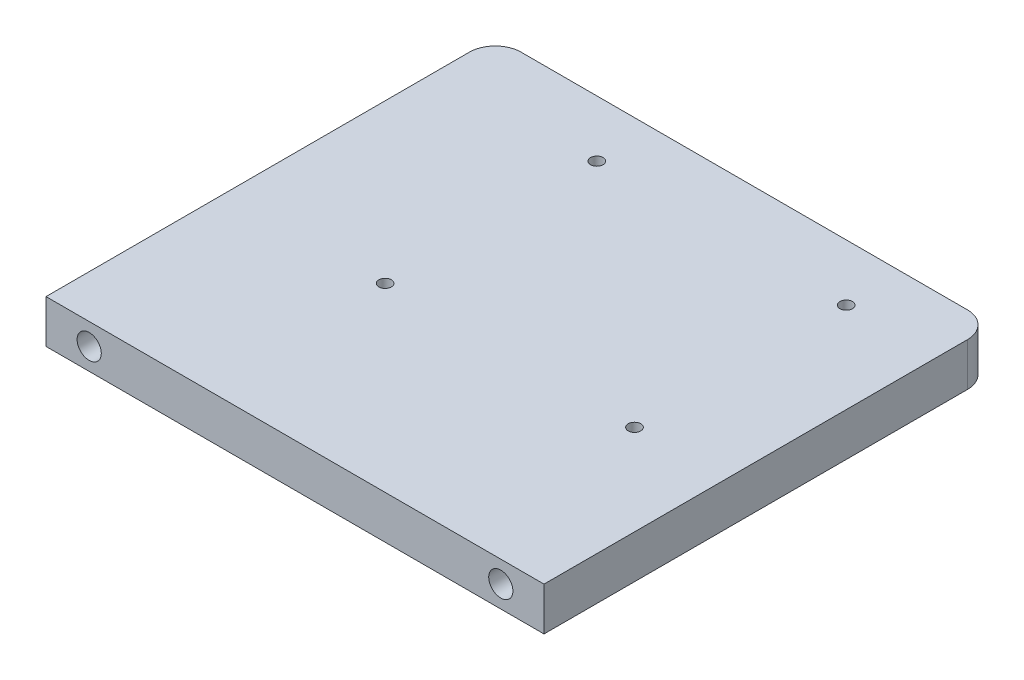
ISO-10303-21;
HEADER;
FILE_DESCRIPTION(('STEP AP214'),'2;1');
FILE_NAME('part.step','',(''),(''),'','','');
FILE_SCHEMA(('AUTOMOTIVE_DESIGN { 1 0 10303 214 1 1 1 1 }'));
ENDSEC;
DATA;
#1=APPLICATION_CONTEXT('core data for automotive mechanical design processes');
#2=APPLICATION_PROTOCOL_DEFINITION('international standard','automotive_design',2000,#1);
#3=PRODUCT_CONTEXT('',#1,'mechanical');
#4=PRODUCT('Part','Part','',(#3));
#5=PRODUCT_RELATED_PRODUCT_CATEGORY('part','',(#4));
#6=PRODUCT_DEFINITION_FORMATION('','',#4);
#7=PRODUCT_DEFINITION_CONTEXT('part definition',#1,'design');
#8=PRODUCT_DEFINITION('design','',#6,#7);
#9=PRODUCT_DEFINITION_SHAPE('','',#8);
#10=(LENGTH_UNIT() NAMED_UNIT(*) SI_UNIT(.MILLI.,.METRE.));
#11=(NAMED_UNIT(*) PLANE_ANGLE_UNIT() SI_UNIT($,.RADIAN.));
#12=(NAMED_UNIT(*) SI_UNIT($,.STERADIAN.) SOLID_ANGLE_UNIT());
#13=UNCERTAINTY_MEASURE_WITH_UNIT(LENGTH_MEASURE(1.E-05),#10,'distance_accuracy_value','');
#14=(GEOMETRIC_REPRESENTATION_CONTEXT(3) GLOBAL_UNCERTAINTY_ASSIGNED_CONTEXT((#13)) GLOBAL_UNIT_ASSIGNED_CONTEXT((#10,
#11,#12)) REPRESENTATION_CONTEXT('',''));
#15=CARTESIAN_POINT('',(0.,0.,0.));
#16=DIRECTION('',(0.,0.,1.));
#17=DIRECTION('',(1.,0.,0.));
#18=AXIS2_PLACEMENT_3D('',#15,#16,#17);
#19=CARTESIAN_POINT('',(62.5,55.,-79.8892794376098));
#20=DIRECTION('',(-1.,0.,0.));
#21=DIRECTION('',(0.,0.,1.));
#22=AXIS2_PLACEMENT_3D('',#19,#20,#21);
#23=PLANE('',#22);
#24=DIRECTION('',(0.,0.,1.));
#25=VECTOR('',#24,1.);
#26=CARTESIAN_POINT('',(62.5,55.,-79.8892794376098));
#27=LINE('',#26,#25);
#28=CARTESIAN_POINT('',(62.5,55.,-73.8892794376098));
#29=VERTEX_POINT('',#28);
#30=CARTESIAN_POINT('',(62.5,55.,24.1107205623902));
#31=VERTEX_POINT('',#30);
#32=EDGE_CURVE('E182',#29,#31,#27,.T.);
#33=ORIENTED_EDGE('',*,*,#32,.F.);
#34=DIRECTION('',(0.,-1.,0.));
#35=VECTOR('',#34,1.);
#36=CARTESIAN_POINT('',(62.5,55.,-73.8892794376098));
#37=LINE('',#36,#35);
#38=CARTESIAN_POINT('',(62.5,65.,-73.8892794376098));
#39=VERTEX_POINT('',#38);
#40=EDGE_CURVE('E64',#29,#39,#37,.F.);
#41=ORIENTED_EDGE('',*,*,#40,.T.);
#42=DIRECTION('',(0.,0.,1.));
#43=VECTOR('',#42,1.);
#44=CARTESIAN_POINT('',(62.5,65.,-79.8892794376098));
#45=LINE('',#44,#43);
#46=CARTESIAN_POINT('',(62.5,65.,24.1107205623901));
#47=VERTEX_POINT('',#46);
#48=EDGE_CURVE('E165',#39,#47,#45,.T.);
#49=ORIENTED_EDGE('',*,*,#48,.T.);
#50=DIRECTION('',(0.,-1.,0.));
#51=VECTOR('',#50,1.);
#52=CARTESIAN_POINT('',(62.5,55.,24.1107205623901));
#53=LINE('',#52,#51);
#54=EDGE_CURVE('E157',#47,#31,#53,.T.);
#55=ORIENTED_EDGE('',*,*,#54,.T.);
#56=EDGE_LOOP('',(#33,#41,#49,#55));
#57=FACE_BOUND('',#56,.T.);
#58=ADVANCED_FACE('F41',(#57),#23,.F.);
#59=CARTESIAN_POINT('',(62.5,55.,-79.8892794376098));
#60=DIRECTION('',(0.,1.,0.));
#61=DIRECTION('',(0.,0.,1.));
#62=AXIS2_PLACEMENT_3D('',#59,#60,#61);
#63=PLANE('',#62);
#64=CARTESIAN_POINT('',(-16.187618629174,55.,-66.7992794376098));
#65=DIRECTION('',(0.,-1.,0.));
#66=DIRECTION('',(0.,0.,-1.));
#67=AXIS2_PLACEMENT_3D('',#64,#65,#66);
#68=CIRCLE('',#67,2.75);
#69=CARTESIAN_POINT('',(-16.187618629174,55.,-69.5492794376098));
#70=VERTEX_POINT('',#69);
#71=EDGE_CURVE('E121',#70,#70,#68,.T.);
#72=ORIENTED_EDGE('',*,*,#71,.F.);
#73=EDGE_LOOP('',(#72));
#74=FACE_BOUND('',#73,.T.);
#75=CARTESIAN_POINT('',(41.542381370826,55.,-66.7992794376098));
#76=DIRECTION('',(0.,-1.,0.));
#77=DIRECTION('',(0.,0.,-1.));
#78=AXIS2_PLACEMENT_3D('',#75,#76,#77);
#79=CIRCLE('',#78,2.75);
#80=CARTESIAN_POINT('',(41.542381370826,55.,-69.5492794376098));
#81=VERTEX_POINT('',#80);
#82=EDGE_CURVE('E130',#81,#81,#79,.T.);
#83=ORIENTED_EDGE('',*,*,#82,.F.);
#84=EDGE_LOOP('',(#83));
#85=FACE_BOUND('',#84,.T.);
#86=CARTESIAN_POINT('',(-16.187618629174,55.,-17.7892794376098));
#87=DIRECTION('',(0.,-1.,0.));
#88=DIRECTION('',(0.,0.,-1.));
#89=AXIS2_PLACEMENT_3D('',#86,#87,#88);
#90=CIRCLE('',#89,2.75);
#91=CARTESIAN_POINT('',(-16.187618629174,55.,-20.5392794376098));
#92=VERTEX_POINT('',#91);
#93=EDGE_CURVE('E139',#92,#92,#90,.T.);
#94=ORIENTED_EDGE('',*,*,#93,.F.);
#95=EDGE_LOOP('',(#94));
#96=FACE_BOUND('',#95,.T.);
#97=CARTESIAN_POINT('',(41.542381370826,55.,-17.7892794376098));
#98=DIRECTION('',(0.,-1.,0.));
#99=DIRECTION('',(0.,0.,-1.));
#100=AXIS2_PLACEMENT_3D('',#97,#98,#99);
#101=CIRCLE('',#100,2.75);
#102=CARTESIAN_POINT('',(41.542381370826,55.,-20.5392794376098));
#103=VERTEX_POINT('',#102);
#104=EDGE_CURVE('E148',#103,#103,#101,.T.);
#105=ORIENTED_EDGE('',*,*,#104,.F.);
#106=EDGE_LOOP('',(#105));
#107=FACE_BOUND('',#106,.T.);
#108=DIRECTION('',(-1.,0.,0.));
#109=VECTOR('',#108,1.);
#110=CARTESIAN_POINT('',(62.5,55.,-79.8892794376098));
#111=LINE('',#110,#109);
#112=CARTESIAN_POINT('',(56.5,55.,-79.8892794376098));
#113=VERTEX_POINT('',#112);
#114=CARTESIAN_POINT('',(-46.792618629174,55.,-79.8892794376098));
#115=VERTEX_POINT('',#114);
#116=EDGE_CURVE('E158',#113,#115,#111,.T.);
#117=ORIENTED_EDGE('',*,*,#116,.F.);
#118=CARTESIAN_POINT('',(56.5,55.,-73.8892794376098));
#119=DIRECTION('',(0.,1.,0.));
#120=DIRECTION('',(0.,0.,1.));
#121=AXIS2_PLACEMENT_3D('',#118,#119,#120);
#122=CIRCLE('',#121,6.);
#123=EDGE_CURVE('E193',#113,#29,#122,.F.);
#124=ORIENTED_EDGE('',*,*,#123,.T.);
#125=ORIENTED_EDGE('',*,*,#32,.T.);
#126=DIRECTION('',(-1.,0.,0.));
#127=VECTOR('',#126,1.);
#128=CARTESIAN_POINT('',(62.5,55.,24.1107205623901));
#129=LINE('',#128,#127);
#130=CARTESIAN_POINT('',(-52.792618629174,55.,24.1107205623902));
#131=VERTEX_POINT('',#130);
#132=EDGE_CURVE('E168',#31,#131,#129,.T.);
#133=ORIENTED_EDGE('',*,*,#132,.T.);
#134=DIRECTION('',(0.,0.,1.));
#135=VECTOR('',#134,1.);
#136=CARTESIAN_POINT('',(-52.792618629174,55.,-79.8892794376098));
#137=LINE('',#136,#135);
#138=CARTESIAN_POINT('',(-52.792618629174,55.,-73.8892794376098));
#139=VERTEX_POINT('',#138);
#140=EDGE_CURVE('E179',#139,#131,#137,.T.);
#141=ORIENTED_EDGE('',*,*,#140,.F.);
#142=CARTESIAN_POINT('',(-46.792618629174,55.,-73.8892794376098));
#143=DIRECTION('',(0.,1.,0.));
#144=DIRECTION('',(0.,0.,1.));
#145=AXIS2_PLACEMENT_3D('',#142,#143,#144);
#146=CIRCLE('',#145,6.);
#147=EDGE_CURVE('E191',#139,#115,#146,.F.);
#148=ORIENTED_EDGE('',*,*,#147,.T.);
#149=EDGE_LOOP('',(#117,#124,#125,#133,#141,#148));
#150=FACE_BOUND('',#149,.T.);
#151=ADVANCED_FACE('F206',(#74,#85,#96,#107,#150),#63,.F.);
#152=CARTESIAN_POINT('',(-52.792618629174,55.,-79.8892794376098));
#153=DIRECTION('',(1.,0.,0.));
#154=DIRECTION('',(0.,1.,0.));
#155=AXIS2_PLACEMENT_3D('',#152,#153,#154);
#156=PLANE('',#155);
#157=DIRECTION('',(0.,0.,1.));
#158=VECTOR('',#157,1.);
#159=CARTESIAN_POINT('',(-52.792618629174,65.,-79.8892794376098));
#160=LINE('',#159,#158);
#161=CARTESIAN_POINT('',(-52.792618629174,65.,-73.8892794376098));
#162=VERTEX_POINT('',#161);
#163=CARTESIAN_POINT('',(-52.792618629174,65.,24.1107205623902));
#164=VERTEX_POINT('',#163);
#165=EDGE_CURVE('E177',#162,#164,#160,.T.);
#166=ORIENTED_EDGE('',*,*,#165,.F.);
#167=DIRECTION('',(0.,1.,0.));
#168=VECTOR('',#167,1.);
#169=CARTESIAN_POINT('',(-52.792618629174,55.,-73.8892794376098));
#170=LINE('',#169,#168);
#171=EDGE_CURVE('E11',#162,#139,#170,.F.);
#172=ORIENTED_EDGE('',*,*,#171,.T.);
#173=ORIENTED_EDGE('',*,*,#140,.T.);
#174=DIRECTION('',(0.,1.,0.));
#175=VECTOR('',#174,1.);
#176=CARTESIAN_POINT('',(-52.792618629174,55.,24.1107205623902));
#177=LINE('',#176,#175);
#178=EDGE_CURVE('E171',#131,#164,#177,.T.);
#179=ORIENTED_EDGE('',*,*,#178,.T.);
#180=EDGE_LOOP('',(#166,#172,#173,#179));
#181=FACE_BOUND('',#180,.T.);
#182=ADVANCED_FACE('F214',(#181),#156,.F.);
#183=CARTESIAN_POINT('',(62.5,65.,-79.8892794376098));
#184=DIRECTION('',(0.,-1.,0.));
#185=DIRECTION('',(0.,0.,-1.));
#186=AXIS2_PLACEMENT_3D('',#183,#184,#185);
#187=PLANE('',#186);
#188=CARTESIAN_POINT('',(-16.187618629174,65.,-66.7992794376098));
#189=DIRECTION('',(0.,-1.,0.));
#190=DIRECTION('',(0.,0.,-1.));
#191=AXIS2_PLACEMENT_3D('',#188,#189,#190);
#192=CIRCLE('',#191,1.44999999999999);
#193=CARTESIAN_POINT('',(-16.187618629174,65.,-68.2492794376098));
#194=VERTEX_POINT('',#193);
#195=EDGE_CURVE('E127',#194,#194,#192,.T.);
#196=ORIENTED_EDGE('',*,*,#195,.T.);
#197=EDGE_LOOP('',(#196));
#198=FACE_BOUND('',#197,.T.);
#199=CARTESIAN_POINT('',(41.542381370826,65.,-66.7992794376098));
#200=DIRECTION('',(0.,-1.,0.));
#201=DIRECTION('',(0.,0.,-1.));
#202=AXIS2_PLACEMENT_3D('',#199,#200,#201);
#203=CIRCLE('',#202,1.44999999999999);
#204=CARTESIAN_POINT('',(41.542381370826,65.,-68.2492794376098));
#205=VERTEX_POINT('',#204);
#206=EDGE_CURVE('E136',#205,#205,#203,.T.);
#207=ORIENTED_EDGE('',*,*,#206,.T.);
#208=EDGE_LOOP('',(#207));
#209=FACE_BOUND('',#208,.T.);
#210=CARTESIAN_POINT('',(-16.187618629174,65.,-17.7892794376098));
#211=DIRECTION('',(0.,-1.,0.));
#212=DIRECTION('',(0.,0.,-1.));
#213=AXIS2_PLACEMENT_3D('',#210,#211,#212);
#214=CIRCLE('',#213,1.44999999999999);
#215=CARTESIAN_POINT('',(-16.187618629174,65.,-19.2392794376098));
#216=VERTEX_POINT('',#215);
#217=EDGE_CURVE('E145',#216,#216,#214,.T.);
#218=ORIENTED_EDGE('',*,*,#217,.T.);
#219=EDGE_LOOP('',(#218));
#220=FACE_BOUND('',#219,.T.);
#221=CARTESIAN_POINT('',(41.542381370826,65.,-17.7892794376098));
#222=DIRECTION('',(0.,-1.,0.));
#223=DIRECTION('',(0.,0.,-1.));
#224=AXIS2_PLACEMENT_3D('',#221,#222,#223);
#225=CIRCLE('',#224,1.44999999999999);
#226=CARTESIAN_POINT('',(41.542381370826,65.,-19.2392794376098));
#227=VERTEX_POINT('',#226);
#228=EDGE_CURVE('E154',#227,#227,#225,.T.);
#229=ORIENTED_EDGE('',*,*,#228,.T.);
#230=EDGE_LOOP('',(#229));
#231=FACE_BOUND('',#230,.T.);
#232=ORIENTED_EDGE('',*,*,#48,.F.);
#233=CARTESIAN_POINT('',(56.5,65.,-73.8892794376098));
#234=DIRECTION('',(0.,-1.,0.));
#235=DIRECTION('',(0.,0.,-1.));
#236=AXIS2_PLACEMENT_3D('',#233,#234,#235);
#237=CIRCLE('',#236,6.);
#238=CARTESIAN_POINT('',(56.5,65.,-79.8892794376098));
#239=VERTEX_POINT('',#238);
#240=EDGE_CURVE('E49',#39,#239,#237,.F.);
#241=ORIENTED_EDGE('',*,*,#240,.T.);
#242=DIRECTION('',(1.,0.,0.));
#243=VECTOR('',#242,1.);
#244=CARTESIAN_POINT('',(62.5,65.,-79.8892794376098));
#245=LINE('',#244,#243);
#246=CARTESIAN_POINT('',(-46.792618629174,65.,-79.8892794376098));
#247=VERTEX_POINT('',#246);
#248=EDGE_CURVE('E161',#247,#239,#245,.T.);
#249=ORIENTED_EDGE('',*,*,#248,.F.);
#250=CARTESIAN_POINT('',(-46.792618629174,65.,-73.8892794376098));
#251=DIRECTION('',(0.,-1.,0.));
#252=DIRECTION('',(0.,0.,-1.));
#253=AXIS2_PLACEMENT_3D('',#250,#251,#252);
#254=CIRCLE('',#253,6.);
#255=EDGE_CURVE('E56',#247,#162,#254,.F.);
#256=ORIENTED_EDGE('',*,*,#255,.T.);
#257=ORIENTED_EDGE('',*,*,#165,.T.);
#258=DIRECTION('',(1.,0.,0.));
#259=VECTOR('',#258,1.);
#260=CARTESIAN_POINT('',(62.5,65.,24.1107205623901));
#261=LINE('',#260,#259);
#262=EDGE_CURVE('E162',#164,#47,#261,.T.);
#263=ORIENTED_EDGE('',*,*,#262,.T.);
#264=EDGE_LOOP('',(#232,#241,#249,#256,#257,#263));
#265=FACE_BOUND('',#264,.T.);
#266=ADVANCED_FACE('F197',(#198,#209,#220,#231,#265),#187,.F.);
#267=CARTESIAN_POINT('',(0.,0.,-79.8892794376098));
#268=DIRECTION('',(0.,0.,1.));
#269=DIRECTION('',(1.,0.,0.));
#270=AXIS2_PLACEMENT_3D('',#267,#268,#269);
#271=PLANE('',#270);
#272=ORIENTED_EDGE('',*,*,#248,.T.);
#273=DIRECTION('',(0.,-1.,0.));
#274=VECTOR('',#273,1.);
#275=CARTESIAN_POINT('',(56.5,0.,-79.8892794376098));
#276=LINE('',#275,#274);
#277=EDGE_CURVE('E188',#239,#113,#276,.T.);
#278=ORIENTED_EDGE('',*,*,#277,.T.);
#279=ORIENTED_EDGE('',*,*,#116,.T.);
#280=DIRECTION('',(0.,1.,0.));
#281=VECTOR('',#280,1.);
#282=CARTESIAN_POINT('',(-46.7926186291741,0.,-79.8892794376098));
#283=LINE('',#282,#281);
#284=EDGE_CURVE('E185',#115,#247,#283,.T.);
#285=ORIENTED_EDGE('',*,*,#284,.T.);
#286=EDGE_LOOP('',(#272,#278,#279,#285));
#287=FACE_BOUND('',#286,.T.);
#288=ADVANCED_FACE('F201',(#287),#271,.F.);
#289=CARTESIAN_POINT('',(56.5,0.,-73.8892794376098));
#290=DIRECTION('',(0.,-1.,0.));
#291=DIRECTION('',(0.,0.,-1.));
#292=AXIS2_PLACEMENT_3D('',#289,#290,#291);
#293=CYLINDRICAL_SURFACE('',#292,6.);
#294=ORIENTED_EDGE('',*,*,#240,.F.);
#295=ORIENTED_EDGE('',*,*,#40,.F.);
#296=ORIENTED_EDGE('',*,*,#123,.F.);
#297=ORIENTED_EDGE('',*,*,#277,.F.);
#298=EDGE_LOOP('',(#294,#295,#296,#297));
#299=FACE_BOUND('',#298,.T.);
#300=ADVANCED_FACE('F204',(#299),#293,.T.);
#301=CARTESIAN_POINT('',(-46.7926186291741,0.,-73.8892794376098));
#302=DIRECTION('',(0.,1.,0.));
#303=DIRECTION('',(-1.,0.,0.));
#304=AXIS2_PLACEMENT_3D('',#301,#302,#303);
#305=CYLINDRICAL_SURFACE('',#304,6.);
#306=ORIENTED_EDGE('',*,*,#147,.F.);
#307=ORIENTED_EDGE('',*,*,#171,.F.);
#308=ORIENTED_EDGE('',*,*,#255,.F.);
#309=ORIENTED_EDGE('',*,*,#284,.F.);
#310=EDGE_LOOP('',(#306,#307,#308,#309));
#311=FACE_BOUND('',#310,.T.);
#312=ADVANCED_FACE('F43',(#311),#305,.T.);
#313=CARTESIAN_POINT('',(41.542381370826,55.,-17.7892794376098));
#314=DIRECTION('',(0.,-1.,0.));
#315=DIRECTION('',(0.,0.,-1.));
#316=AXIS2_PLACEMENT_3D('',#313,#314,#315);
#317=CYLINDRICAL_SURFACE('',#316,1.44999999999999);
#318=ORIENTED_EDGE('',*,*,#228,.F.);
#319=EDGE_LOOP('',(#318));
#320=FACE_BOUND('',#319,.T.);
#321=CARTESIAN_POINT('',(41.542381370826,56.3,-17.7892794376098));
#322=DIRECTION('',(0.,-1.,0.));
#323=DIRECTION('',(0.,0.,-1.));
#324=AXIS2_PLACEMENT_3D('',#321,#322,#323);
#325=CIRCLE('',#324,1.44999999999999);
#326=CARTESIAN_POINT('',(41.542381370826,56.3,-19.2392794376098));
#327=VERTEX_POINT('',#326);
#328=EDGE_CURVE('E151',#327,#327,#325,.T.);
#329=ORIENTED_EDGE('',*,*,#328,.T.);
#330=EDGE_LOOP('',(#329));
#331=FACE_BOUND('',#330,.T.);
#332=ADVANCED_FACE('F234',(#320,#331),#317,.F.);
#333=CARTESIAN_POINT('',(41.542381370826,55.,-17.7892794376098));
#334=DIRECTION('',(0.,-1.,0.));
#335=DIRECTION('',(0.,0.,-1.));
#336=AXIS2_PLACEMENT_3D('',#333,#334,#335);
#337=CONICAL_SURFACE('',#336,2.75,0.785398163397451);
#338=ORIENTED_EDGE('',*,*,#328,.F.);
#339=EDGE_LOOP('',(#338));
#340=FACE_BOUND('',#339,.T.);
#341=ORIENTED_EDGE('',*,*,#104,.T.);
#342=EDGE_LOOP('',(#341));
#343=FACE_BOUND('',#342,.T.);
#344=ADVANCED_FACE('F241',(#340,#343),#337,.F.);
#345=CARTESIAN_POINT('',(-16.187618629174,55.,-17.7892794376098));
#346=DIRECTION('',(0.,-1.,0.));
#347=DIRECTION('',(0.,0.,-1.));
#348=AXIS2_PLACEMENT_3D('',#345,#346,#347);
#349=CYLINDRICAL_SURFACE('',#348,1.44999999999999);
#350=ORIENTED_EDGE('',*,*,#217,.F.);
#351=EDGE_LOOP('',(#350));
#352=FACE_BOUND('',#351,.T.);
#353=CARTESIAN_POINT('',(-16.187618629174,56.3,-17.7892794376098));
#354=DIRECTION('',(0.,-1.,0.));
#355=DIRECTION('',(0.,0.,-1.));
#356=AXIS2_PLACEMENT_3D('',#353,#354,#355);
#357=CIRCLE('',#356,1.44999999999999);
#358=CARTESIAN_POINT('',(-16.187618629174,56.3,-19.2392794376098));
#359=VERTEX_POINT('',#358);
#360=EDGE_CURVE('E142',#359,#359,#357,.T.);
#361=ORIENTED_EDGE('',*,*,#360,.T.);
#362=EDGE_LOOP('',(#361));
#363=FACE_BOUND('',#362,.T.);
#364=ADVANCED_FACE('F245',(#352,#363),#349,.F.);
#365=CARTESIAN_POINT('',(-16.187618629174,55.,-17.7892794376098));
#366=DIRECTION('',(0.,-1.,0.));
#367=DIRECTION('',(0.,0.,-1.));
#368=AXIS2_PLACEMENT_3D('',#365,#366,#367);
#369=CONICAL_SURFACE('',#368,2.75,0.785398163397449);
#370=ORIENTED_EDGE('',*,*,#360,.F.);
#371=EDGE_LOOP('',(#370));
#372=FACE_BOUND('',#371,.T.);
#373=ORIENTED_EDGE('',*,*,#93,.T.);
#374=EDGE_LOOP('',(#373));
#375=FACE_BOUND('',#374,.T.);
#376=ADVANCED_FACE('F249',(#372,#375),#369,.F.);
#377=CARTESIAN_POINT('',(41.542381370826,55.,-66.7992794376098));
#378=DIRECTION('',(0.,-1.,0.));
#379=DIRECTION('',(0.,0.,-1.));
#380=AXIS2_PLACEMENT_3D('',#377,#378,#379);
#381=CYLINDRICAL_SURFACE('',#380,1.44999999999999);
#382=ORIENTED_EDGE('',*,*,#206,.F.);
#383=EDGE_LOOP('',(#382));
#384=FACE_BOUND('',#383,.T.);
#385=CARTESIAN_POINT('',(41.542381370826,56.3,-66.7992794376098));
#386=DIRECTION('',(0.,-1.,0.));
#387=DIRECTION('',(0.,0.,-1.));
#388=AXIS2_PLACEMENT_3D('',#385,#386,#387);
#389=CIRCLE('',#388,1.44999999999999);
#390=CARTESIAN_POINT('',(41.542381370826,56.3,-68.2492794376098));
#391=VERTEX_POINT('',#390);
#392=EDGE_CURVE('E133',#391,#391,#389,.T.);
#393=ORIENTED_EDGE('',*,*,#392,.T.);
#394=EDGE_LOOP('',(#393));
#395=FACE_BOUND('',#394,.T.);
#396=ADVANCED_FACE('F253',(#384,#395),#381,.F.);
#397=CARTESIAN_POINT('',(41.542381370826,55.,-66.7992794376098));
#398=DIRECTION('',(0.,-1.,0.));
#399=DIRECTION('',(0.,0.,-1.));
#400=AXIS2_PLACEMENT_3D('',#397,#398,#399);
#401=CONICAL_SURFACE('',#400,2.75,0.785398163397451);
#402=ORIENTED_EDGE('',*,*,#392,.F.);
#403=EDGE_LOOP('',(#402));
#404=FACE_BOUND('',#403,.T.);
#405=ORIENTED_EDGE('',*,*,#82,.T.);
#406=EDGE_LOOP('',(#405));
#407=FACE_BOUND('',#406,.T.);
#408=ADVANCED_FACE('F257',(#404,#407),#401,.F.);
#409=CARTESIAN_POINT('',(-16.187618629174,55.,-66.7992794376098));
#410=DIRECTION('',(0.,-1.,0.));
#411=DIRECTION('',(0.,0.,-1.));
#412=AXIS2_PLACEMENT_3D('',#409,#410,#411);
#413=CYLINDRICAL_SURFACE('',#412,1.44999999999999);
#414=ORIENTED_EDGE('',*,*,#195,.F.);
#415=EDGE_LOOP('',(#414));
#416=FACE_BOUND('',#415,.T.);
#417=CARTESIAN_POINT('',(-16.187618629174,56.3,-66.7992794376098));
#418=DIRECTION('',(0.,-1.,0.));
#419=DIRECTION('',(0.,0.,-1.));
#420=AXIS2_PLACEMENT_3D('',#417,#418,#419);
#421=CIRCLE('',#420,1.44999999999999);
#422=CARTESIAN_POINT('',(-16.187618629174,56.3,-68.2492794376098));
#423=VERTEX_POINT('',#422);
#424=EDGE_CURVE('E124',#423,#423,#421,.T.);
#425=ORIENTED_EDGE('',*,*,#424,.T.);
#426=EDGE_LOOP('',(#425));
#427=FACE_BOUND('',#426,.T.);
#428=ADVANCED_FACE('F261',(#416,#427),#413,.F.);
#429=CARTESIAN_POINT('',(-16.187618629174,55.,-66.7992794376098));
#430=DIRECTION('',(0.,-1.,0.));
#431=DIRECTION('',(0.,0.,-1.));
#432=AXIS2_PLACEMENT_3D('',#429,#430,#431);
#433=CONICAL_SURFACE('',#432,2.75,0.785398163397449);
#434=ORIENTED_EDGE('',*,*,#424,.F.);
#435=EDGE_LOOP('',(#434));
#436=FACE_BOUND('',#435,.T.);
#437=ORIENTED_EDGE('',*,*,#71,.T.);
#438=EDGE_LOOP('',(#437));
#439=FACE_BOUND('',#438,.T.);
#440=ADVANCED_FACE('F265',(#436,#439),#433,.F.);
#441=CARTESIAN_POINT('',(-62.792618629174,-191.52893659857,24.1107205623902));
#442=DIRECTION('',(0.,0.,-1.));
#443=DIRECTION('',(-1.,0.,0.));
#444=AXIS2_PLACEMENT_3D('',#441,#442,#443);
#445=PLANE('',#444);
#446=CARTESIAN_POINT('',(-42.792618629174,60.,24.1107205623902));
#447=DIRECTION('',(0.,0.,1.));
#448=DIRECTION('',(1.,0.,0.));
#449=AXIS2_PLACEMENT_3D('',#446,#447,#448);
#450=CIRCLE('',#449,2.8);
#451=CARTESIAN_POINT('',(-39.992618629174,60.,24.1107205623902));
#452=VERTEX_POINT('',#451);
#453=EDGE_CURVE('E111',#452,#452,#450,.T.);
#454=ORIENTED_EDGE('',*,*,#453,.F.);
#455=EDGE_LOOP('',(#454));
#456=FACE_BOUND('',#455,.T.);
#457=CARTESIAN_POINT('',(52.5,60.,24.1107205623902));
#458=DIRECTION('',(0.,0.,1.));
#459=DIRECTION('',(1.,0.,0.));
#460=AXIS2_PLACEMENT_3D('',#457,#458,#459);
#461=CIRCLE('',#460,2.8);
#462=CARTESIAN_POINT('',(55.3,60.,24.1107205623902));
#463=VERTEX_POINT('',#462);
#464=EDGE_CURVE('E110',#463,#463,#461,.T.);
#465=ORIENTED_EDGE('',*,*,#464,.F.);
#466=EDGE_LOOP('',(#465));
#467=FACE_BOUND('',#466,.T.);
#468=ORIENTED_EDGE('',*,*,#262,.F.);
#469=ORIENTED_EDGE('',*,*,#178,.F.);
#470=ORIENTED_EDGE('',*,*,#132,.F.);
#471=ORIENTED_EDGE('',*,*,#54,.F.);
#472=EDGE_LOOP('',(#468,#469,#470,#471));
#473=FACE_BOUND('',#472,.T.);
#474=ADVANCED_FACE('F208',(#456,#467,#473),#445,.F.);
#475=CARTESIAN_POINT('',(52.5,60.,16.1107205623902));
#476=DIRECTION('',(0.,0.,1.));
#477=DIRECTION('',(1.,0.,0.));
#478=AXIS2_PLACEMENT_3D('',#475,#476,#477);
#479=CONICAL_SURFACE('',#478,2.8,1.02974425867665);
#480=CARTESIAN_POINT('',(52.5,60.,14.428310829113));
#481=VERTEX_POINT('',#480);
#482=VERTEX_LOOP('',#481);
#483=FACE_BOUND('',#482,.T.);
#484=CARTESIAN_POINT('',(52.5,60.,16.1107205623902));
#485=DIRECTION('',(0.,0.,1.));
#486=DIRECTION('',(1.,0.,0.));
#487=AXIS2_PLACEMENT_3D('',#484,#485,#486);
#488=CIRCLE('',#487,2.8);
#489=CARTESIAN_POINT('',(55.3,60.,16.1107205623902));
#490=VERTEX_POINT('',#489);
#491=EDGE_CURVE('E114',#490,#490,#488,.T.);
#492=ORIENTED_EDGE('',*,*,#491,.T.);
#493=EDGE_LOOP('',(#492));
#494=FACE_BOUND('',#493,.T.);
#495=ADVANCED_FACE('F272',(#483,#494),#479,.F.);
#496=CARTESIAN_POINT('',(52.5,60.,24.1107205623902));
#497=DIRECTION('',(0.,0.,1.));
#498=DIRECTION('',(1.,0.,0.));
#499=AXIS2_PLACEMENT_3D('',#496,#497,#498);
#500=CYLINDRICAL_SURFACE('',#499,2.8);
#501=ORIENTED_EDGE('',*,*,#491,.F.);
#502=EDGE_LOOP('',(#501));
#503=FACE_BOUND('',#502,.T.);
#504=ORIENTED_EDGE('',*,*,#464,.T.);
#505=EDGE_LOOP('',(#504));
#506=FACE_BOUND('',#505,.T.);
#507=ADVANCED_FACE('F104',(#503,#506),#500,.F.);
#508=CARTESIAN_POINT('',(-42.792618629174,60.,16.1107205623902));
#509=DIRECTION('',(0.,0.,1.));
#510=DIRECTION('',(1.,0.,0.));
#511=AXIS2_PLACEMENT_3D('',#508,#509,#510);
#512=CONICAL_SURFACE('',#511,2.8,1.02974425867665);
#513=CARTESIAN_POINT('',(-42.792618629174,60.,14.428310829113));
#514=VERTEX_POINT('',#513);
#515=VERTEX_LOOP('',#514);
#516=FACE_BOUND('',#515,.T.);
#517=CARTESIAN_POINT('',(-42.792618629174,60.,16.1107205623902));
#518=DIRECTION('',(0.,0.,1.));
#519=DIRECTION('',(1.,0.,0.));
#520=AXIS2_PLACEMENT_3D('',#517,#518,#519);
#521=CIRCLE('',#520,2.8);
#522=CARTESIAN_POINT('',(-39.992618629174,60.,16.1107205623902));
#523=VERTEX_POINT('',#522);
#524=EDGE_CURVE('E108',#523,#523,#521,.T.);
#525=ORIENTED_EDGE('',*,*,#524,.T.);
#526=EDGE_LOOP('',(#525));
#527=FACE_BOUND('',#526,.T.);
#528=ADVANCED_FACE('F100',(#516,#527),#512,.F.);
#529=CARTESIAN_POINT('',(-42.792618629174,60.,24.1107205623902));
#530=DIRECTION('',(0.,0.,1.));
#531=DIRECTION('',(1.,0.,0.));
#532=AXIS2_PLACEMENT_3D('',#529,#530,#531);
#533=CYLINDRICAL_SURFACE('',#532,2.8);
#534=ORIENTED_EDGE('',*,*,#524,.F.);
#535=EDGE_LOOP('',(#534));
#536=FACE_BOUND('',#535,.T.);
#537=ORIENTED_EDGE('',*,*,#453,.T.);
#538=EDGE_LOOP('',(#537));
#539=FACE_BOUND('',#538,.T.);
#540=ADVANCED_FACE('F103',(#536,#539),#533,.F.);
#541=CLOSED_SHELL('',(#58,#151,#182,#266,#288,#300,#312,#332,#344,#364,#376,#396,#408,#428,#440,
#474,#495,#507,#528,#540));
#542=MANIFOLD_SOLID_BREP('B2',#541);
#543=ADVANCED_BREP_SHAPE_REPRESENTATION('',(#18,#542),#14);
#544=SHAPE_DEFINITION_REPRESENTATION(#9,#543);
ENDSEC;
END-ISO-10303-21;
